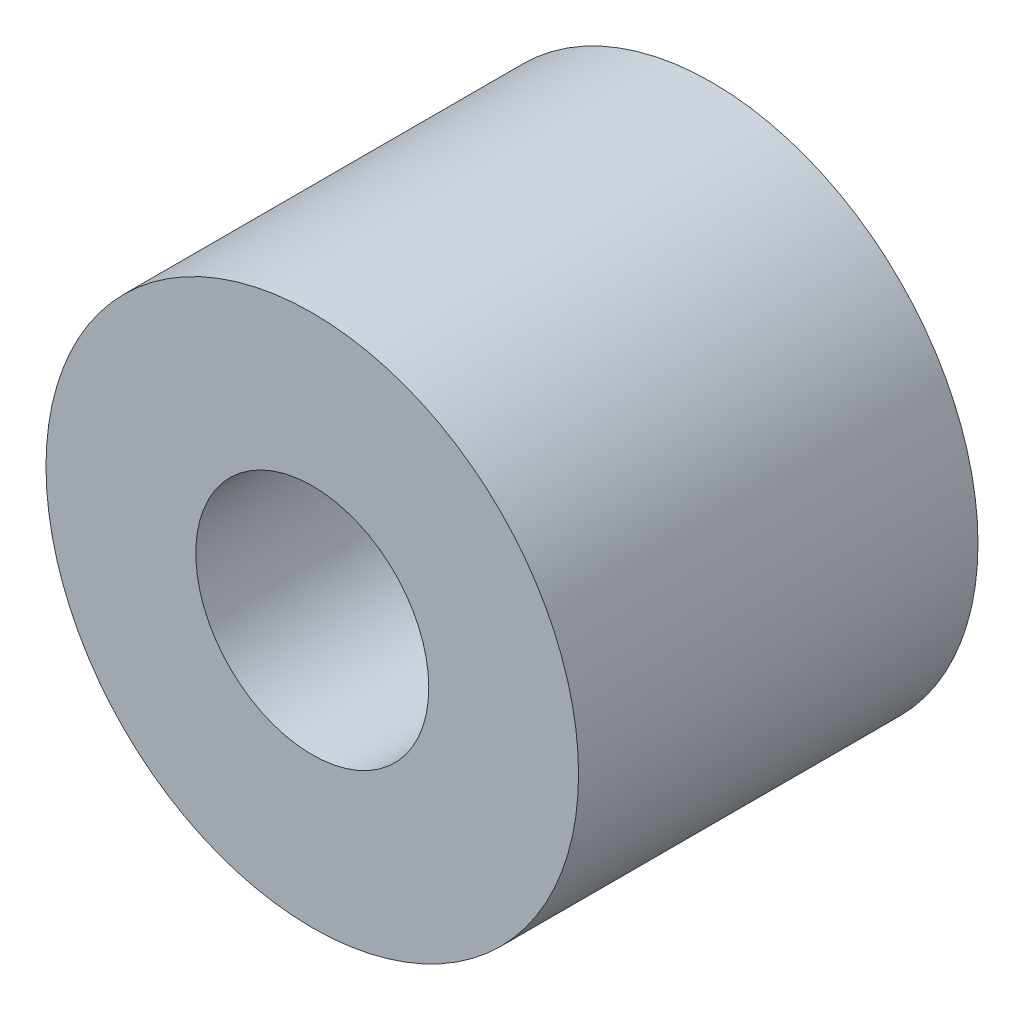
ISO-10303-21;
HEADER;
FILE_DESCRIPTION(('STEP AP214'),'2;1');
FILE_NAME('part.step','',(''),(''),'','','');
FILE_SCHEMA(('AUTOMOTIVE_DESIGN { 1 0 10303 214 1 1 1 1 }'));
ENDSEC;
DATA;
#1=APPLICATION_CONTEXT('core data for automotive mechanical design processes');
#2=APPLICATION_PROTOCOL_DEFINITION('international standard','automotive_design',2000,#1);
#3=PRODUCT_CONTEXT('',#1,'mechanical');
#4=PRODUCT('Part','Part','',(#3));
#5=PRODUCT_RELATED_PRODUCT_CATEGORY('part','',(#4));
#6=PRODUCT_DEFINITION_FORMATION('','',#4);
#7=PRODUCT_DEFINITION_CONTEXT('part definition',#1,'design');
#8=PRODUCT_DEFINITION('design','',#6,#7);
#9=PRODUCT_DEFINITION_SHAPE('','',#8);
#10=(LENGTH_UNIT() NAMED_UNIT(*) SI_UNIT(.MILLI.,.METRE.));
#11=(NAMED_UNIT(*) PLANE_ANGLE_UNIT() SI_UNIT($,.RADIAN.));
#12=(NAMED_UNIT(*) SI_UNIT($,.STERADIAN.) SOLID_ANGLE_UNIT());
#13=UNCERTAINTY_MEASURE_WITH_UNIT(LENGTH_MEASURE(1.E-05),#10,'distance_accuracy_value','');
#14=(GEOMETRIC_REPRESENTATION_CONTEXT(3) GLOBAL_UNCERTAINTY_ASSIGNED_CONTEXT((#13)) GLOBAL_UNIT_ASSIGNED_CONTEXT((#10,
#11,#12)) REPRESENTATION_CONTEXT('',''));
#15=CARTESIAN_POINT('',(0.,0.,0.));
#16=DIRECTION('',(0.,0.,1.));
#17=DIRECTION('',(1.,0.,0.));
#18=AXIS2_PLACEMENT_3D('',#15,#16,#17);
#19=CARTESIAN_POINT('',(0.,0.,6.));
#20=DIRECTION('',(0.,0.,1.));
#21=DIRECTION('',(1.,0.,0.));
#22=AXIS2_PLACEMENT_3D('',#19,#20,#21);
#23=PLANE('',#22);
#24=CARTESIAN_POINT('',(0.,0.,6.));
#25=DIRECTION('',(0.,0.,1.));
#26=DIRECTION('',(1.,0.,0.));
#27=AXIS2_PLACEMENT_3D('',#24,#25,#26);
#28=CIRCLE('',#27,4.);
#29=CARTESIAN_POINT('',(4.,0.,6.));
#30=VERTEX_POINT('',#29);
#31=EDGE_CURVE('E10',#30,#30,#28,.T.);
#32=ORIENTED_EDGE('',*,*,#31,.T.);
#33=EDGE_LOOP('',(#32));
#34=FACE_BOUND('',#33,.T.);
#35=CARTESIAN_POINT('',(0.,0.,6.));
#36=DIRECTION('',(0.,0.,1.));
#37=DIRECTION('',(1.,0.,0.));
#38=AXIS2_PLACEMENT_3D('',#35,#36,#37);
#39=CIRCLE('',#38,1.75);
#40=CARTESIAN_POINT('',(1.75,0.,6.));
#41=VERTEX_POINT('',#40);
#42=EDGE_CURVE('E42',#41,#41,#39,.T.);
#43=ORIENTED_EDGE('',*,*,#42,.F.);
#44=EDGE_LOOP('',(#43));
#45=FACE_BOUND('',#44,.T.);
#46=ADVANCED_FACE('F31',(#34,#45),#23,.T.);
#47=CARTESIAN_POINT('',(0.,0.,0.));
#48=DIRECTION('',(0.,0.,1.));
#49=DIRECTION('',(1.,0.,0.));
#50=AXIS2_PLACEMENT_3D('',#47,#48,#49);
#51=PLANE('',#50);
#52=CARTESIAN_POINT('',(0.,0.,0.));
#53=DIRECTION('',(0.,0.,1.));
#54=DIRECTION('',(1.,0.,0.));
#55=AXIS2_PLACEMENT_3D('',#52,#53,#54);
#56=CIRCLE('',#55,4.);
#57=CARTESIAN_POINT('',(4.,0.,0.));
#58=VERTEX_POINT('',#57);
#59=EDGE_CURVE('E35',#58,#58,#56,.T.);
#60=ORIENTED_EDGE('',*,*,#59,.F.);
#61=EDGE_LOOP('',(#60));
#62=FACE_BOUND('',#61,.T.);
#63=CARTESIAN_POINT('',(0.,0.,0.));
#64=DIRECTION('',(0.,0.,1.));
#65=DIRECTION('',(1.,0.,0.));
#66=AXIS2_PLACEMENT_3D('',#63,#64,#65);
#67=CIRCLE('',#66,1.75);
#68=CARTESIAN_POINT('',(1.75,0.,0.));
#69=VERTEX_POINT('',#68);
#70=EDGE_CURVE('E44',#69,#69,#67,.T.);
#71=ORIENTED_EDGE('',*,*,#70,.T.);
#72=EDGE_LOOP('',(#71));
#73=FACE_BOUND('',#72,.T.);
#74=ADVANCED_FACE('F54',(#62,#73),#51,.F.);
#75=CARTESIAN_POINT('',(0.,0.,6.));
#76=DIRECTION('',(0.,0.,-1.));
#77=DIRECTION('',(-1.,0.,0.));
#78=AXIS2_PLACEMENT_3D('',#75,#76,#77);
#79=CYLINDRICAL_SURFACE('',#78,4.);
#80=ORIENTED_EDGE('',*,*,#31,.F.);
#81=EDGE_LOOP('',(#80));
#82=FACE_BOUND('',#81,.T.);
#83=ORIENTED_EDGE('',*,*,#59,.T.);
#84=EDGE_LOOP('',(#83));
#85=FACE_BOUND('',#84,.T.);
#86=ADVANCED_FACE('F33',(#82,#85),#79,.T.);
#87=CARTESIAN_POINT('',(0.,0.,6.));
#88=DIRECTION('',(0.,0.,-1.));
#89=DIRECTION('',(-1.,0.,0.));
#90=AXIS2_PLACEMENT_3D('',#87,#88,#89);
#91=CYLINDRICAL_SURFACE('',#90,1.75);
#92=ORIENTED_EDGE('',*,*,#42,.T.);
#93=EDGE_LOOP('',(#92));
#94=FACE_BOUND('',#93,.T.);
#95=ORIENTED_EDGE('',*,*,#70,.F.);
#96=EDGE_LOOP('',(#95));
#97=FACE_BOUND('',#96,.T.);
#98=ADVANCED_FACE('F50',(#94,#97),#91,.F.);
#99=CLOSED_SHELL('',(#46,#74,#86,#98));
#100=MANIFOLD_SOLID_BREP('B2',#99);
#101=ADVANCED_BREP_SHAPE_REPRESENTATION('',(#18,#100),#14);
#102=SHAPE_DEFINITION_REPRESENTATION(#9,#101);
ENDSEC;
END-ISO-10303-21;
